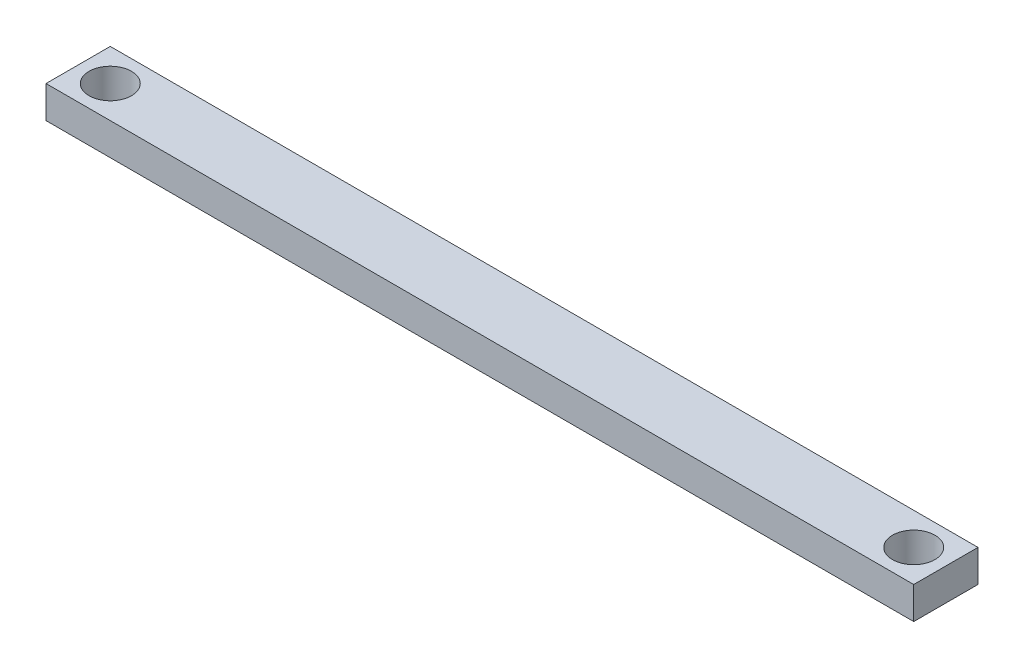
ISO-10303-21;
HEADER;
FILE_DESCRIPTION(('STEP AP214'),'2;1');
FILE_NAME('part.step','',(''),(''),'','','');
FILE_SCHEMA(('AUTOMOTIVE_DESIGN { 1 0 10303 214 1 1 1 1 }'));
ENDSEC;
DATA;
#1=APPLICATION_CONTEXT('core data for automotive mechanical design processes');
#2=APPLICATION_PROTOCOL_DEFINITION('international standard','automotive_design',2000,#1);
#3=PRODUCT_CONTEXT('',#1,'mechanical');
#4=PRODUCT('Part','Part','',(#3));
#5=PRODUCT_RELATED_PRODUCT_CATEGORY('part','',(#4));
#6=PRODUCT_DEFINITION_FORMATION('','',#4);
#7=PRODUCT_DEFINITION_CONTEXT('part definition',#1,'design');
#8=PRODUCT_DEFINITION('design','',#6,#7);
#9=PRODUCT_DEFINITION_SHAPE('','',#8);
#10=(LENGTH_UNIT() NAMED_UNIT(*) SI_UNIT(.MILLI.,.METRE.));
#11=(NAMED_UNIT(*) PLANE_ANGLE_UNIT() SI_UNIT($,.RADIAN.));
#12=(NAMED_UNIT(*) SI_UNIT($,.STERADIAN.) SOLID_ANGLE_UNIT());
#13=UNCERTAINTY_MEASURE_WITH_UNIT(LENGTH_MEASURE(1.E-05),#10,'distance_accuracy_value','');
#14=(GEOMETRIC_REPRESENTATION_CONTEXT(3) GLOBAL_UNCERTAINTY_ASSIGNED_CONTEXT((#13)) GLOBAL_UNIT_ASSIGNED_CONTEXT((#10,
#11,#12)) REPRESENTATION_CONTEXT('',''));
#15=CARTESIAN_POINT('',(0.,0.,0.));
#16=DIRECTION('',(0.,0.,1.));
#17=DIRECTION('',(1.,0.,0.));
#18=AXIS2_PLACEMENT_3D('',#15,#16,#17);
#19=CARTESIAN_POINT('',(0.,25.,0.));
#20=DIRECTION('',(0.,-1.,0.));
#21=DIRECTION('',(0.,0.,-1.));
#22=AXIS2_PLACEMENT_3D('',#19,#20,#21);
#23=PLANE('',#22);
#24=DIRECTION('',(0.,0.,1.));
#25=VECTOR('',#24,1.);
#26=CARTESIAN_POINT('',(0.,25.,0.));
#27=LINE('',#26,#25);
#28=CARTESIAN_POINT('',(0.,25.,-50.));
#29=VERTEX_POINT('',#28);
#30=CARTESIAN_POINT('',(0.,25.,0.));
#31=VERTEX_POINT('',#30);
#32=EDGE_CURVE('E92',#29,#31,#27,.T.);
#33=ORIENTED_EDGE('',*,*,#32,.T.);
#34=DIRECTION('',(1.,0.,0.));
#35=VECTOR('',#34,1.);
#36=CARTESIAN_POINT('',(0.,25.,0.));
#37=LINE('',#36,#35);
#38=CARTESIAN_POINT('',(675.,25.,0.));
#39=VERTEX_POINT('',#38);
#40=EDGE_CURVE('E87',#31,#39,#37,.T.);
#41=ORIENTED_EDGE('',*,*,#40,.T.);
#42=DIRECTION('',(0.,0.,-1.));
#43=VECTOR('',#42,1.);
#44=CARTESIAN_POINT('',(675.,25.,0.));
#45=LINE('',#44,#43);
#46=CARTESIAN_POINT('',(675.,25.,-50.));
#47=VERTEX_POINT('',#46);
#48=EDGE_CURVE('E90',#39,#47,#45,.T.);
#49=ORIENTED_EDGE('',*,*,#48,.T.);
#50=DIRECTION('',(-1.,0.,0.));
#51=VECTOR('',#50,1.);
#52=CARTESIAN_POINT('',(0.,25.,-50.));
#53=LINE('',#52,#51);
#54=EDGE_CURVE('E57',#47,#29,#53,.T.);
#55=ORIENTED_EDGE('',*,*,#54,.T.);
#56=EDGE_LOOP('',(#33,#41,#49,#55));
#57=FACE_BOUND('',#56,.T.);
#58=CARTESIAN_POINT('',(25.,25.,-25.));
#59=DIRECTION('',(0.,1.,0.));
#60=DIRECTION('',(0.,0.,1.));
#61=AXIS2_PLACEMENT_3D('',#58,#59,#60);
#62=CIRCLE('',#61,16.5);
#63=CARTESIAN_POINT('',(25.,25.,-8.5));
#64=VERTEX_POINT('',#63);
#65=EDGE_CURVE('E112',#64,#64,#62,.T.);
#66=ORIENTED_EDGE('',*,*,#65,.F.);
#67=EDGE_LOOP('',(#66));
#68=FACE_BOUND('',#67,.T.);
#69=CARTESIAN_POINT('',(650.,25.,-25.));
#70=DIRECTION('',(0.,1.,0.));
#71=DIRECTION('',(0.,0.,1.));
#72=AXIS2_PLACEMENT_3D('',#69,#70,#71);
#73=CIRCLE('',#72,16.5);
#74=CARTESIAN_POINT('',(650.,25.,-8.50000000000001));
#75=VERTEX_POINT('',#74);
#76=EDGE_CURVE('E134',#75,#75,#73,.T.);
#77=ORIENTED_EDGE('',*,*,#76,.F.);
#78=EDGE_LOOP('',(#77));
#79=FACE_BOUND('',#78,.T.);
#80=ADVANCED_FACE('F39',(#57,#68,#79),#23,.F.);
#81=CARTESIAN_POINT('',(0.,0.,0.));
#82=DIRECTION('',(0.,-1.,0.));
#83=DIRECTION('',(0.,0.,-1.));
#84=AXIS2_PLACEMENT_3D('',#81,#82,#83);
#85=PLANE('',#84);
#86=CARTESIAN_POINT('',(25.,0.,-25.));
#87=DIRECTION('',(0.,1.,0.));
#88=DIRECTION('',(0.,0.,1.));
#89=AXIS2_PLACEMENT_3D('',#86,#87,#88);
#90=CIRCLE('',#89,16.5);
#91=CARTESIAN_POINT('',(25.,0.,-8.5));
#92=VERTEX_POINT('',#91);
#93=EDGE_CURVE('E130',#92,#92,#90,.T.);
#94=ORIENTED_EDGE('',*,*,#93,.T.);
#95=EDGE_LOOP('',(#94));
#96=FACE_BOUND('',#95,.T.);
#97=DIRECTION('',(0.,0.,1.));
#98=VECTOR('',#97,1.);
#99=CARTESIAN_POINT('',(0.,0.,0.));
#100=LINE('',#99,#98);
#101=CARTESIAN_POINT('',(0.,0.,-50.));
#102=VERTEX_POINT('',#101);
#103=CARTESIAN_POINT('',(0.,0.,0.));
#104=VERTEX_POINT('',#103);
#105=EDGE_CURVE('E108',#102,#104,#100,.T.);
#106=ORIENTED_EDGE('',*,*,#105,.F.);
#107=DIRECTION('',(-1.,0.,0.));
#108=VECTOR('',#107,1.);
#109=CARTESIAN_POINT('',(0.,0.,-50.));
#110=LINE('',#109,#108);
#111=CARTESIAN_POINT('',(675.,0.,-50.));
#112=VERTEX_POINT('',#111);
#113=EDGE_CURVE('E80',#112,#102,#110,.T.);
#114=ORIENTED_EDGE('',*,*,#113,.F.);
#115=DIRECTION('',(0.,0.,-1.));
#116=VECTOR('',#115,1.);
#117=CARTESIAN_POINT('',(675.,0.,0.));
#118=LINE('',#117,#116);
#119=CARTESIAN_POINT('',(675.,0.,0.));
#120=VERTEX_POINT('',#119);
#121=EDGE_CURVE('E74',#120,#112,#118,.T.);
#122=ORIENTED_EDGE('',*,*,#121,.F.);
#123=DIRECTION('',(1.,0.,0.));
#124=VECTOR('',#123,1.);
#125=CARTESIAN_POINT('',(0.,0.,0.));
#126=LINE('',#125,#124);
#127=EDGE_CURVE('E97',#104,#120,#126,.T.);
#128=ORIENTED_EDGE('',*,*,#127,.F.);
#129=EDGE_LOOP('',(#106,#114,#122,#128));
#130=FACE_BOUND('',#129,.T.);
#131=CARTESIAN_POINT('',(650.,0.,-25.));
#132=DIRECTION('',(0.,1.,0.));
#133=DIRECTION('',(0.,0.,1.));
#134=AXIS2_PLACEMENT_3D('',#131,#132,#133);
#135=CIRCLE('',#134,16.5);
#136=CARTESIAN_POINT('',(650.,0.,-8.50000000000001));
#137=VERTEX_POINT('',#136);
#138=EDGE_CURVE('E138',#137,#137,#135,.T.);
#139=ORIENTED_EDGE('',*,*,#138,.T.);
#140=EDGE_LOOP('',(#139));
#141=FACE_BOUND('',#140,.T.);
#142=ADVANCED_FACE('F125',(#96,#130,#141),#85,.T.);
#143=CARTESIAN_POINT('',(0.,25.,0.));
#144=DIRECTION('',(1.,0.,0.));
#145=DIRECTION('',(0.,0.,-1.));
#146=AXIS2_PLACEMENT_3D('',#143,#144,#145);
#147=PLANE('',#146);
#148=ORIENTED_EDGE('',*,*,#105,.T.);
#149=DIRECTION('',(0.,-1.,0.));
#150=VECTOR('',#149,1.);
#151=CARTESIAN_POINT('',(0.,25.,0.));
#152=LINE('',#151,#150);
#153=EDGE_CURVE('E11',#31,#104,#152,.T.);
#154=ORIENTED_EDGE('',*,*,#153,.F.);
#155=ORIENTED_EDGE('',*,*,#32,.F.);
#156=DIRECTION('',(0.,-1.,0.));
#157=VECTOR('',#156,1.);
#158=CARTESIAN_POINT('',(0.,25.,-50.));
#159=LINE('',#158,#157);
#160=EDGE_CURVE('E104',#29,#102,#159,.T.);
#161=ORIENTED_EDGE('',*,*,#160,.T.);
#162=EDGE_LOOP('',(#148,#154,#155,#161));
#163=FACE_BOUND('',#162,.T.);
#164=ADVANCED_FACE('F41',(#163),#147,.F.);
#165=CARTESIAN_POINT('',(0.,25.,0.));
#166=DIRECTION('',(0.,0.,-1.));
#167=DIRECTION('',(-1.,0.,0.));
#168=AXIS2_PLACEMENT_3D('',#165,#166,#167);
#169=PLANE('',#168);
#170=ORIENTED_EDGE('',*,*,#127,.T.);
#171=DIRECTION('',(0.,-1.,0.));
#172=VECTOR('',#171,1.);
#173=CARTESIAN_POINT('',(675.,25.,0.));
#174=LINE('',#173,#172);
#175=EDGE_CURVE('E49',#39,#120,#174,.T.);
#176=ORIENTED_EDGE('',*,*,#175,.F.);
#177=ORIENTED_EDGE('',*,*,#40,.F.);
#178=ORIENTED_EDGE('',*,*,#153,.T.);
#179=EDGE_LOOP('',(#170,#176,#177,#178));
#180=FACE_BOUND('',#179,.T.);
#181=ADVANCED_FACE('F96',(#180),#169,.F.);
#182=CARTESIAN_POINT('',(675.,25.,0.));
#183=DIRECTION('',(-1.,0.,0.));
#184=DIRECTION('',(0.,0.,1.));
#185=AXIS2_PLACEMENT_3D('',#182,#183,#184);
#186=PLANE('',#185);
#187=ORIENTED_EDGE('',*,*,#121,.T.);
#188=DIRECTION('',(0.,-1.,0.));
#189=VECTOR('',#188,1.);
#190=CARTESIAN_POINT('',(675.,25.,-50.));
#191=LINE('',#190,#189);
#192=EDGE_CURVE('E99',#47,#112,#191,.T.);
#193=ORIENTED_EDGE('',*,*,#192,.F.);
#194=ORIENTED_EDGE('',*,*,#48,.F.);
#195=ORIENTED_EDGE('',*,*,#175,.T.);
#196=EDGE_LOOP('',(#187,#193,#194,#195));
#197=FACE_BOUND('',#196,.T.);
#198=ADVANCED_FACE('F100',(#197),#186,.F.);
#199=CARTESIAN_POINT('',(0.,25.,-50.));
#200=DIRECTION('',(0.,0.,1.));
#201=DIRECTION('',(1.,0.,0.));
#202=AXIS2_PLACEMENT_3D('',#199,#200,#201);
#203=PLANE('',#202);
#204=ORIENTED_EDGE('',*,*,#113,.T.);
#205=ORIENTED_EDGE('',*,*,#160,.F.);
#206=ORIENTED_EDGE('',*,*,#54,.F.);
#207=ORIENTED_EDGE('',*,*,#192,.T.);
#208=EDGE_LOOP('',(#204,#205,#206,#207));
#209=FACE_BOUND('',#208,.T.);
#210=ADVANCED_FACE('F122',(#209),#203,.F.);
#211=CARTESIAN_POINT('',(25.,25.,-25.));
#212=DIRECTION('',(0.,-1.,0.));
#213=DIRECTION('',(0.,0.,-1.));
#214=AXIS2_PLACEMENT_3D('',#211,#212,#213);
#215=CYLINDRICAL_SURFACE('',#214,16.5);
#216=ORIENTED_EDGE('',*,*,#65,.T.);
#217=EDGE_LOOP('',(#216));
#218=FACE_BOUND('',#217,.T.);
#219=ORIENTED_EDGE('',*,*,#93,.F.);
#220=EDGE_LOOP('',(#219));
#221=FACE_BOUND('',#220,.T.);
#222=ADVANCED_FACE('F157',(#218,#221),#215,.F.);
#223=CARTESIAN_POINT('',(650.,25.,-25.));
#224=DIRECTION('',(0.,-1.,0.));
#225=DIRECTION('',(0.,0.,-1.));
#226=AXIS2_PLACEMENT_3D('',#223,#224,#225);
#227=CYLINDRICAL_SURFACE('',#226,16.5);
#228=ORIENTED_EDGE('',*,*,#76,.T.);
#229=EDGE_LOOP('',(#228));
#230=FACE_BOUND('',#229,.T.);
#231=ORIENTED_EDGE('',*,*,#138,.F.);
#232=EDGE_LOOP('',(#231));
#233=FACE_BOUND('',#232,.T.);
#234=ADVANCED_FACE('F146',(#230,#233),#227,.F.);
#235=CLOSED_SHELL('',(#80,#142,#164,#181,#198,#210,#222,#234));
#236=MANIFOLD_SOLID_BREP('B2',#235);
#237=ADVANCED_BREP_SHAPE_REPRESENTATION('',(#18,#236),#14);
#238=SHAPE_DEFINITION_REPRESENTATION(#9,#237);
ENDSEC;
END-ISO-10303-21;
